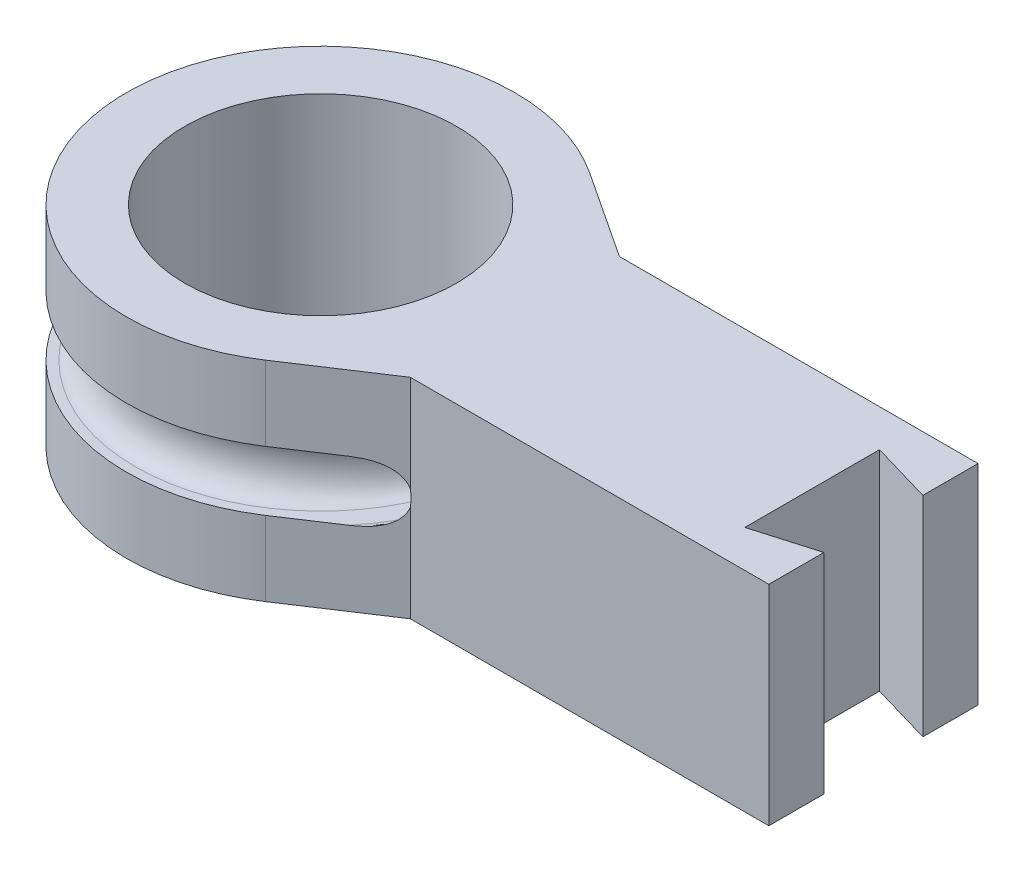
ISO-10303-21;
HEADER;
FILE_DESCRIPTION(('STEP AP214'),'2;1');
FILE_NAME('part.step','',(''),(''),'','','');
FILE_SCHEMA(('AUTOMOTIVE_DESIGN { 1 0 10303 214 1 1 1 1 }'));
ENDSEC;
DATA;
#1=APPLICATION_CONTEXT('core data for automotive mechanical design processes');
#2=APPLICATION_PROTOCOL_DEFINITION('international standard','automotive_design',2000,#1);
#3=PRODUCT_CONTEXT('',#1,'mechanical');
#4=PRODUCT('Part','Part','',(#3));
#5=PRODUCT_RELATED_PRODUCT_CATEGORY('part','',(#4));
#6=PRODUCT_DEFINITION_FORMATION('','',#4);
#7=PRODUCT_DEFINITION_CONTEXT('part definition',#1,'design');
#8=PRODUCT_DEFINITION('design','',#6,#7);
#9=PRODUCT_DEFINITION_SHAPE('','',#8);
#10=(LENGTH_UNIT() NAMED_UNIT(*) SI_UNIT(.MILLI.,.METRE.));
#11=(NAMED_UNIT(*) PLANE_ANGLE_UNIT() SI_UNIT($,.RADIAN.));
#12=(NAMED_UNIT(*) SI_UNIT($,.STERADIAN.) SOLID_ANGLE_UNIT());
#13=UNCERTAINTY_MEASURE_WITH_UNIT(LENGTH_MEASURE(1.E-05),#10,'distance_accuracy_value','');
#14=(GEOMETRIC_REPRESENTATION_CONTEXT(3) GLOBAL_UNCERTAINTY_ASSIGNED_CONTEXT((#13)) GLOBAL_UNIT_ASSIGNED_CONTEXT((#10,
#11,#12)) REPRESENTATION_CONTEXT('',''));
#15=CARTESIAN_POINT('',(0.,0.,0.));
#16=DIRECTION('',(0.,0.,1.));
#17=DIRECTION('',(1.,0.,0.));
#18=AXIS2_PLACEMENT_3D('',#15,#16,#17);
#19=CARTESIAN_POINT('',(6.5,7.,3.5));
#20=DIRECTION('',(0.55045871559633,0.,0.834862385321101));
#21=DIRECTION('',(0.834862385321101,0.,-0.550458715596331));
#22=AXIS2_PLACEMENT_3D('',#19,#20,#21);
#23=PLANE('',#22);
#24=DIRECTION('',(0.,-1.,0.));
#25=VECTOR('',#24,1.);
#26=CARTESIAN_POINT('',(6.5,7.,3.5));
#27=LINE('',#26,#25);
#28=CARTESIAN_POINT('',(6.5,3.22819521393696,3.5));
#29=VERTEX_POINT('',#28);
#30=CARTESIAN_POINT('',(6.5,0.,3.5));
#31=VERTEX_POINT('',#30);
#32=EDGE_CURVE('E136',#29,#31,#27,.T.);
#33=ORIENTED_EDGE('',*,*,#32,.F.);
#34=CARTESIAN_POINT('',(6.5,3.22819521393696,3.5));
#35=CARTESIAN_POINT('',(6.49298885962438,3.20469516467334,3.50462272991799));
#36=CARTESIAN_POINT('',(6.48509078213773,3.18159174419673,3.50983025353557));
#37=CARTESIAN_POINT('',(6.4676292095555,3.13632563999783,3.52134337831506));
#38=CARTESIAN_POINT('',(6.45806692554476,3.11416228665261,3.5276481809595));
#39=CARTESIAN_POINT('',(6.4271701424211,3.04954817687565,3.54801968631576));
#40=CARTESIAN_POINT('',(6.40352715088067,3.00864941863856,3.56360847194681));
#41=CARTESIAN_POINT('',(6.35122634688263,2.93199747904386,3.59809251853892));
#42=CARTESIAN_POINT('',(6.32258098093215,2.89623191890055,3.61697957301177));
#43=CARTESIAN_POINT('',(6.26130875530846,2.82999557694114,3.65737884265376));
#44=CARTESIAN_POINT('',(6.22867936221696,2.79952819436519,3.6788927282086));
#45=CARTESIAN_POINT('',(6.14261151228912,2.72931895435917,3.73564076112805));
#46=CARTESIAN_POINT('',(6.08720395804548,2.69304151305721,3.7721732144755));
#47=CARTESIAN_POINT('',(5.97202145654329,2.63130486525718,3.84811772096047));
#48=CARTESIAN_POINT('',(5.91221817444313,2.60592467527972,3.88754845641113));
#49=CARTESIAN_POINT('',(5.80290160328918,2.56869608794661,3.95962531651263));
#50=CARTESIAN_POINT('',(5.75377552755207,2.55514396868166,3.99201613567995));
#51=CARTESIAN_POINT('',(5.65469493921246,2.53298119535897,4.05734399612365));
#52=CARTESIAN_POINT('',(5.6047393361746,2.52437768043018,4.0902817563684));
#53=CARTESIAN_POINT('',(5.50558498743192,2.51141106624854,4.15565825004489));
#54=CARTESIAN_POINT('',(5.45639390173347,2.50695848848075,4.18809193292299));
#55=CARTESIAN_POINT('',(5.35804858954869,2.50126576603422,4.25293499590197));
#56=CARTESIAN_POINT('',(5.30889483077422,2.50001449332246,4.2853440676214));
#57=CARTESIAN_POINT('',(5.25977353990362,2.50000000000001,4.31773173193168));
#58=B_SPLINE_CURVE_WITH_KNOTS('',3,(#34,#35,#36,#37,#38,#39,#40,#41,#42,#43,#44,#45,#46,#47,#48,
#49,#50,#51,#52,#53,#54,#55,#56,#57),.UNSPECIFIED.,.F.,.F.,(4,2,2,2,2,2,2,2,2,2,2,4),(0.,
0.074812067165254,0.149569917637081,0.298065349054375,0.446196437635228,0.594422217290496,
0.820046961292381,1.04728117151874,1.22819830623822,1.40937579153491,1.58655078582427,
1.76310906141737),.UNSPECIFIED.);
#59=CARTESIAN_POINT('',(5.25977353990362,2.5,4.31773173193168));
#60=VERTEX_POINT('',#59);
#61=EDGE_CURVE('E301',#29,#60,#58,.T.);
#62=ORIENTED_EDGE('',*,*,#61,.T.);
#63=DIRECTION('',(-0.834862385321101,0.,0.550458715596331));
#64=VECTOR('',#63,1.);
#65=CARTESIAN_POINT('',(6.5,2.5,3.5));
#66=LINE('',#65,#64);
#67=CARTESIAN_POINT('',(3.57798165137617,2.5,5.42660550458714));
#68=VERTEX_POINT('',#67);
#69=EDGE_CURVE('E336',#60,#68,#66,.T.);
#70=ORIENTED_EDGE('',*,*,#69,.T.);
#71=DIRECTION('',(0.,-1.,0.));
#72=VECTOR('',#71,1.);
#73=CARTESIAN_POINT('',(3.57798165137617,7.,5.42660550458714));
#74=LINE('',#73,#72);
#75=CARTESIAN_POINT('',(3.57798165137617,0.,5.42660550458714));
#76=VERTEX_POINT('',#75);
#77=EDGE_CURVE('E199',#68,#76,#74,.T.);
#78=ORIENTED_EDGE('',*,*,#77,.T.);
#79=DIRECTION('',(-0.834862385321101,0.,0.550458715596331));
#80=VECTOR('',#79,1.);
#81=CARTESIAN_POINT('',(6.5,0.,3.5));
#82=LINE('',#81,#80);
#83=EDGE_CURVE('E200',#31,#76,#82,.T.);
#84=ORIENTED_EDGE('',*,*,#83,.F.);
#85=EDGE_LOOP('',(#33,#62,#70,#78,#84));
#86=FACE_BOUND('',#85,.T.);
#87=ADVANCED_FACE('F66',(#86),#23,.T.);
#88=DIRECTION('',(0.834862385321101,0.,-0.550458715596331));
#89=VECTOR('',#88,1.);
#90=CARTESIAN_POINT('',(6.5,4.5,3.5));
#91=LINE('',#90,#89);
#92=CARTESIAN_POINT('',(3.57798165137617,4.5,5.42660550458714));
#93=VERTEX_POINT('',#92);
#94=CARTESIAN_POINT('',(5.25977353990362,4.5,4.31773173193168));
#95=VERTEX_POINT('',#94);
#96=EDGE_CURVE('E87',#93,#95,#91,.T.);
#97=ORIENTED_EDGE('',*,*,#96,.T.);
#98=CARTESIAN_POINT('',(5.25977353990362,4.49999999999999,4.31773173193168));
#99=CARTESIAN_POINT('',(5.30980424482652,4.49998439536465,4.28474445396054));
#100=CARTESIAN_POINT('',(5.35987068639977,4.49868682887248,4.25173361336279));
#101=CARTESIAN_POINT('',(5.46005090812943,4.49276777287092,4.18568071991466));
#102=CARTESIAN_POINT('',(5.51016414799452,4.48813369889372,4.15263902330032));
#103=CARTESIAN_POINT('',(5.61094447698106,4.47464810066926,4.08619045473776));
#104=CARTESIAN_POINT('',(5.66160493164622,4.46572098860302,4.05278795715634));
#105=CARTESIAN_POINT('',(5.76204144244888,4.44271920763919,3.98656608190183));
#106=CARTESIAN_POINT('',(5.81181878729647,4.42865282179579,3.95374585452979));
#107=CARTESIAN_POINT('',(5.91591925169782,4.39229422808132,3.88510818569373));
#108=CARTESIAN_POINT('',(5.97005539985535,4.36920741181808,3.84941402207339));
#109=CARTESIAN_POINT('',(6.07484169827637,4.31405208518454,3.78032415498262));
#110=CARTESIAN_POINT('',(6.12550687984914,4.2820258141525,3.7469185407588));
#111=CARTESIAN_POINT('',(6.21346194251687,4.21418852231523,3.68892619174711));
#112=CARTESIAN_POINT('',(6.25156972941101,4.17991393322606,3.66380017841032));
#113=CARTESIAN_POINT('',(6.32255321365137,4.10433540844639,3.61699788110899));
#114=CARTESIAN_POINT('',(6.35543710357269,4.06304269401956,3.59531619544659));
#115=CARTESIAN_POINT('',(6.40934731927945,3.98149490764916,3.55977099827729));
#116=CARTESIAN_POINT('',(6.43143912221,3.9422574826338,3.54520497436703));
#117=CARTESIAN_POINT('',(6.46041108861024,3.88047320305739,3.5261025789383));
#118=CARTESIAN_POINT('',(6.46939610863209,3.85931801873014,3.52017838991291));
#119=CARTESIAN_POINT('',(6.4858560007254,3.8161630395596,3.50932571380743));
#120=CARTESIAN_POINT('',(6.49332976949673,3.79416264150562,3.50439795417798));
#121=CARTESIAN_POINT('',(6.5,3.77180478606305,3.5));
#122=B_SPLINE_CURVE_WITH_KNOTS('',3,(#98,#99,#100,#101,#102,#103,#104,#105,#106,#107,#108,#109,
#110,#111,#112,#113,#114,#115,#116,#117,#118,#119,#120,#121),.UNSPECIFIED.,.F.,.F.,(4,2,2,2,2,2,
2,2,2,2,2,4),(0.,0.179831729267228,0.360345315866386,0.544160534446972,0.727680792492196,
0.933606689487284,1.13857558490959,1.309156452813,1.47946710193905,1.62081594714583,
1.69194682388597,1.76312944423503),.UNSPECIFIED.);
#123=CARTESIAN_POINT('',(6.5,3.77180478606305,3.5));
#124=VERTEX_POINT('',#123);
#125=EDGE_CURVE('E327',#95,#124,#122,.T.);
#126=ORIENTED_EDGE('',*,*,#125,.T.);
#127=CARTESIAN_POINT('',(6.5,7.,3.5));
#128=VERTEX_POINT('',#127);
#129=EDGE_CURVE('E96',#128,#124,#27,.T.);
#130=ORIENTED_EDGE('',*,*,#129,.F.);
#131=DIRECTION('',(-0.834862385321101,0.,0.550458715596331));
#132=VECTOR('',#131,1.);
#133=CARTESIAN_POINT('',(6.5,7.,3.5));
#134=LINE('',#133,#132);
#135=CARTESIAN_POINT('',(3.57798165137617,7.,5.42660550458714));
#136=VERTEX_POINT('',#135);
#137=EDGE_CURVE('E227',#128,#136,#134,.T.);
#138=ORIENTED_EDGE('',*,*,#137,.T.);
#139=EDGE_CURVE('E246',#136,#93,#74,.T.);
#140=ORIENTED_EDGE('',*,*,#139,.T.);
#141=EDGE_LOOP('',(#97,#126,#130,#138,#140));
#142=FACE_BOUND('',#141,.T.);
#143=ADVANCED_FACE('F289',(#142),#23,.T.);
#144=CARTESIAN_POINT('',(6.5,7.,3.5));
#145=DIRECTION('',(0.,0.,-1.));
#146=DIRECTION('',(-1.,0.,0.));
#147=AXIS2_PLACEMENT_3D('',#144,#145,#146);
#148=PLANE('',#147);
#149=CARTESIAN_POINT('',(6.5,3.22819521393696,3.5));
#150=CARTESIAN_POINT('',(6.5304746179953,3.391795322888,3.50000000000001));
#151=CARTESIAN_POINT('',(6.53381508751579,3.55338363151334,3.50000000000001));
#152=CARTESIAN_POINT('',(6.50709218233565,3.73260551260419,3.5));
#153=CARTESIAN_POINT('',(6.50375171281517,3.75222039468755,3.5));
#154=CARTESIAN_POINT('',(6.5,3.77180478606305,3.5));
#155=B_SPLINE_CURVE_WITH_KNOTS('',3,(#149,#150,#151,#152,#153,#154),.UNSPECIFIED.,.F.,.F.,(4,2,
4),(0.,0.48486849968743,0.544560383740886),.UNSPECIFIED.);
#156=EDGE_CURVE('E329',#29,#124,#155,.T.);
#157=ORIENTED_EDGE('',*,*,#156,.F.);
#158=ORIENTED_EDGE('',*,*,#32,.T.);
#159=DIRECTION('',(1.,0.,0.));
#160=VECTOR('',#159,1.);
#161=CARTESIAN_POINT('',(6.5,0.,3.5));
#162=LINE('',#161,#160);
#163=CARTESIAN_POINT('',(18.5,0.,3.5));
#164=VERTEX_POINT('',#163);
#165=EDGE_CURVE('E225',#31,#164,#162,.T.);
#166=ORIENTED_EDGE('',*,*,#165,.T.);
#167=DIRECTION('',(0.,-1.,0.));
#168=VECTOR('',#167,1.);
#169=CARTESIAN_POINT('',(18.5,7.,3.5));
#170=LINE('',#169,#168);
#171=CARTESIAN_POINT('',(18.5,7.,3.5));
#172=VERTEX_POINT('',#171);
#173=EDGE_CURVE('E187',#172,#164,#170,.T.);
#174=ORIENTED_EDGE('',*,*,#173,.F.);
#175=DIRECTION('',(1.,0.,0.));
#176=VECTOR('',#175,1.);
#177=CARTESIAN_POINT('',(6.5,7.,3.5));
#178=LINE('',#177,#176);
#179=EDGE_CURVE('E174',#128,#172,#178,.T.);
#180=ORIENTED_EDGE('',*,*,#179,.F.);
#181=ORIENTED_EDGE('',*,*,#129,.T.);
#182=EDGE_LOOP('',(#157,#158,#166,#174,#180,#181));
#183=FACE_BOUND('',#182,.T.);
#184=ADVANCED_FACE('F294',(#183),#148,.F.);
#185=CARTESIAN_POINT('',(6.5,7.,-3.5));
#186=DIRECTION('',(0.,0.,-1.));
#187=DIRECTION('',(-1.,0.,0.));
#188=AXIS2_PLACEMENT_3D('',#185,#186,#187);
#189=PLANE('',#188);
#190=DIRECTION('',(0.,-1.,0.));
#191=VECTOR('',#190,1.);
#192=CARTESIAN_POINT('',(6.5,7.,-3.5));
#193=LINE('',#192,#191);
#194=CARTESIAN_POINT('',(6.5,3.22819521393695,-3.5));
#195=VERTEX_POINT('',#194);
#196=CARTESIAN_POINT('',(6.5,0.,-3.5));
#197=VERTEX_POINT('',#196);
#198=EDGE_CURVE('E241',#195,#197,#193,.T.);
#199=ORIENTED_EDGE('',*,*,#198,.F.);
#200=CARTESIAN_POINT('',(6.5,3.22819521393695,-3.5));
#201=CARTESIAN_POINT('',(6.53047461799531,3.39179532288799,-3.49999999999998));
#202=CARTESIAN_POINT('',(6.5338150875158,3.55338363151333,-3.49999999999998));
#203=CARTESIAN_POINT('',(6.50709218233565,3.73260551260419,-3.5));
#204=CARTESIAN_POINT('',(6.50375171281517,3.75222039468755,-3.5));
#205=CARTESIAN_POINT('',(6.5,3.77180478606305,-3.5));
#206=B_SPLINE_CURVE_WITH_KNOTS('',3,(#200,#201,#202,#203,#204,#205),.UNSPECIFIED.,.F.,.F.,(4,2,
4),(0.,0.48486849968743,0.544560383740898),.UNSPECIFIED.);
#207=CARTESIAN_POINT('',(6.5,3.77180478606305,-3.5));
#208=VERTEX_POINT('',#207);
#209=EDGE_CURVE('E343',#195,#208,#206,.T.);
#210=ORIENTED_EDGE('',*,*,#209,.T.);
#211=CARTESIAN_POINT('',(6.5,7.,-3.5));
#212=VERTEX_POINT('',#211);
#213=EDGE_CURVE('E238',#212,#208,#193,.T.);
#214=ORIENTED_EDGE('',*,*,#213,.F.);
#215=DIRECTION('',(1.,0.,0.));
#216=VECTOR('',#215,1.);
#217=CARTESIAN_POINT('',(6.5,7.,-3.5));
#218=LINE('',#217,#216);
#219=CARTESIAN_POINT('',(18.5,7.,-3.5));
#220=VERTEX_POINT('',#219);
#221=EDGE_CURVE('E544',#212,#220,#218,.T.);
#222=ORIENTED_EDGE('',*,*,#221,.T.);
#223=DIRECTION('',(0.,-1.,0.));
#224=VECTOR('',#223,1.);
#225=CARTESIAN_POINT('',(18.5,7.,-3.5));
#226=LINE('',#225,#224);
#227=CARTESIAN_POINT('',(18.5,0.,-3.5));
#228=VERTEX_POINT('',#227);
#229=EDGE_CURVE('E236',#220,#228,#226,.T.);
#230=ORIENTED_EDGE('',*,*,#229,.T.);
#231=DIRECTION('',(1.,0.,0.));
#232=VECTOR('',#231,1.);
#233=CARTESIAN_POINT('',(6.5,0.,-3.5));
#234=LINE('',#233,#232);
#235=EDGE_CURVE('E210',#197,#228,#234,.T.);
#236=ORIENTED_EDGE('',*,*,#235,.F.);
#237=EDGE_LOOP('',(#199,#210,#214,#222,#230,#236));
#238=FACE_BOUND('',#237,.T.);
#239=ADVANCED_FACE('F355',(#238),#189,.T.);
#240=CARTESIAN_POINT('',(6.5,7.,-3.5));
#241=DIRECTION('',(-0.550458715596331,0.,0.834862385321101));
#242=DIRECTION('',(0.834862385321101,0.,0.550458715596331));
#243=AXIS2_PLACEMENT_3D('',#240,#241,#242);
#244=PLANE('',#243);
#245=CARTESIAN_POINT('',(6.5,3.22819521393695,-3.5));
#246=CARTESIAN_POINT('',(6.49298885962437,3.20469516467334,-3.50462272991799));
#247=CARTESIAN_POINT('',(6.48509078213772,3.18159174419672,-3.50983025353557));
#248=CARTESIAN_POINT('',(6.4676292095555,3.13632563999783,-3.52134337831506));
#249=CARTESIAN_POINT('',(6.45806692554476,3.1141622866526,-3.5276481809595));
#250=CARTESIAN_POINT('',(6.4271701424211,3.04954817687564,-3.54801968631576));
#251=CARTESIAN_POINT('',(6.40352715088067,3.00864941863855,-3.56360847194681));
#252=CARTESIAN_POINT('',(6.35122634688263,2.93199747904385,-3.59809251853893));
#253=CARTESIAN_POINT('',(6.32258098093214,2.89623191890054,-3.61697957301177));
#254=CARTESIAN_POINT('',(6.26130875530845,2.82999557694114,-3.65737884265377));
#255=CARTESIAN_POINT('',(6.22867936221695,2.79952819436519,-3.6788927282086));
#256=CARTESIAN_POINT('',(6.14261151228911,2.72931895435917,-3.73564076112805));
#257=CARTESIAN_POINT('',(6.08720395804548,2.69304151305721,-3.77217321447551));
#258=CARTESIAN_POINT('',(5.97202145654328,2.63130486525718,-3.84811772096047));
#259=CARTESIAN_POINT('',(5.91221817444312,2.60592467527971,-3.88754845641113));
#260=CARTESIAN_POINT('',(5.80290160328917,2.5686960879466,-3.95962531651264));
#261=CARTESIAN_POINT('',(5.75377552755207,2.55514396868166,-3.99201613567995));
#262=CARTESIAN_POINT('',(5.65469493921245,2.53298119535897,-4.05734399612366));
#263=CARTESIAN_POINT('',(5.60473933617459,2.52437768043018,-4.0902817563684));
#264=CARTESIAN_POINT('',(5.50558498743192,2.51141106624854,-4.15565825004489));
#265=CARTESIAN_POINT('',(5.45639390173347,2.50695848848075,-4.18809193292299));
#266=CARTESIAN_POINT('',(5.35804858954869,2.50126576603422,-4.25293499590196));
#267=CARTESIAN_POINT('',(5.30889483077422,2.50001449332246,-4.28534406762139));
#268=CARTESIAN_POINT('',(5.25977353990362,2.50000000000001,-4.31773173193167));
#269=B_SPLINE_CURVE_WITH_KNOTS('',3,(#245,#246,#247,#248,#249,#250,#251,#252,#253,#254,#255,
#256,#257,#258,#259,#260,#261,#262,#263,#264,#265,#266,#267,#268),.UNSPECIFIED.,.F.,.F.,(4,2,2,
2,2,2,2,2,2,2,2,4),(0.,0.0748120671652539,0.149569917637081,0.298065349054377,0.446196437635229,
0.594422217290497,0.820046961292383,1.04728117151874,1.22819830623822,1.40937579153491,
1.58655078582426,1.76310906141736),.UNSPECIFIED.);
#270=CARTESIAN_POINT('',(5.25977353990362,2.5,-4.31773173193168));
#271=VERTEX_POINT('',#270);
#272=EDGE_CURVE('E12',#195,#271,#269,.T.);
#273=ORIENTED_EDGE('',*,*,#272,.F.);
#274=ORIENTED_EDGE('',*,*,#198,.T.);
#275=DIRECTION('',(-0.834862385321101,0.,-0.550458715596331));
#276=VECTOR('',#275,1.);
#277=CARTESIAN_POINT('',(6.5,0.,-3.5));
#278=LINE('',#277,#276);
#279=CARTESIAN_POINT('',(3.57798165137615,0.,-5.42660550458716));
#280=VERTEX_POINT('',#279);
#281=EDGE_CURVE('E207',#197,#280,#278,.T.);
#282=ORIENTED_EDGE('',*,*,#281,.T.);
#283=DIRECTION('',(0.,-1.,0.));
#284=VECTOR('',#283,1.);
#285=CARTESIAN_POINT('',(3.57798165137615,7.,-5.42660550458716));
#286=LINE('',#285,#284);
#287=CARTESIAN_POINT('',(3.57798165137615,2.5,-5.42660550458716));
#288=VERTEX_POINT('',#287);
#289=EDGE_CURVE('E245',#288,#280,#286,.T.);
#290=ORIENTED_EDGE('',*,*,#289,.F.);
#291=DIRECTION('',(-0.834862385321101,0.,-0.550458715596331));
#292=VECTOR('',#291,1.);
#293=CARTESIAN_POINT('',(6.5,2.5,-3.5));
#294=LINE('',#293,#292);
#295=EDGE_CURVE('E334',#271,#288,#294,.T.);
#296=ORIENTED_EDGE('',*,*,#295,.F.);
#297=EDGE_LOOP('',(#273,#274,#282,#290,#296));
#298=FACE_BOUND('',#297,.T.);
#299=ADVANCED_FACE('F257',(#298),#244,.F.);
#300=CARTESIAN_POINT('',(5.25977353990362,4.49999999999999,-4.31773173193168));
#301=CARTESIAN_POINT('',(5.30980424482652,4.49998439536465,-4.28474445396054));
#302=CARTESIAN_POINT('',(5.35987068639978,4.49868682887249,-4.25173361336279));
#303=CARTESIAN_POINT('',(5.46005090812944,4.49276777287092,-4.18568071991466));
#304=CARTESIAN_POINT('',(5.51016414799452,4.48813369889372,-4.15263902330031));
#305=CARTESIAN_POINT('',(5.61094447698106,4.47464810066926,-4.08619045473776));
#306=CARTESIAN_POINT('',(5.66160493164622,4.46572098860302,-4.05278795715634));
#307=CARTESIAN_POINT('',(5.76204144244888,4.44271920763919,-3.98656608190183));
#308=CARTESIAN_POINT('',(5.81181878729647,4.42865282179579,-3.95374585452979));
#309=CARTESIAN_POINT('',(5.91591925169783,4.39229422808132,-3.88510818569373));
#310=CARTESIAN_POINT('',(5.97005539985535,4.36920741181808,-3.84941402207339));
#311=CARTESIAN_POINT('',(6.07484169827637,4.31405208518454,-3.78032415498262));
#312=CARTESIAN_POINT('',(6.12550687984914,4.2820258141525,-3.7469185407588));
#313=CARTESIAN_POINT('',(6.21346194251688,4.21418852231523,-3.68892619174711));
#314=CARTESIAN_POINT('',(6.25156972941101,4.17991393322605,-3.66380017841032));
#315=CARTESIAN_POINT('',(6.32255321365138,4.10433540844639,-3.61699788110898));
#316=CARTESIAN_POINT('',(6.35543710357269,4.06304269401956,-3.59531619544657));
#317=CARTESIAN_POINT('',(6.40934731927945,3.98149490764916,-3.55977099827728));
#318=CARTESIAN_POINT('',(6.43143912221,3.9422574826338,-3.54520497436703));
#319=CARTESIAN_POINT('',(6.46041108861024,3.88047320305738,-3.5261025789383));
#320=CARTESIAN_POINT('',(6.46939610863209,3.85931801873014,-3.52017838991291));
#321=CARTESIAN_POINT('',(6.4858560007254,3.81616303955961,-3.50932571380743));
#322=CARTESIAN_POINT('',(6.49332976949673,3.79416264150563,-3.50439795417798));
#323=CARTESIAN_POINT('',(6.5,3.77180478606305,-3.5));
#324=B_SPLINE_CURVE_WITH_KNOTS('',3,(#300,#301,#302,#303,#304,#305,#306,#307,#308,#309,#310,
#311,#312,#313,#314,#315,#316,#317,#318,#319,#320,#321,#322,#323),.UNSPECIFIED.,.F.,.F.,(4,2,2,
2,2,2,2,2,2,2,2,4),(0.,0.179831729267229,0.360345315866388,0.544160534446972,0.727680792492197,
0.933606689487283,1.13857558490959,1.309156452813,1.47946710193905,1.62081594714583,
1.69194682388597,1.76312944423502),.UNSPECIFIED.);
#325=CARTESIAN_POINT('',(5.25977353990362,4.5,-4.31773173193168));
#326=VERTEX_POINT('',#325);
#327=EDGE_CURVE('E80',#326,#208,#324,.T.);
#328=ORIENTED_EDGE('',*,*,#327,.F.);
#329=DIRECTION('',(0.834862385321101,0.,0.550458715596331));
#330=VECTOR('',#329,1.);
#331=CARTESIAN_POINT('',(6.5,4.5,-3.5));
#332=LINE('',#331,#330);
#333=CARTESIAN_POINT('',(3.57798165137615,4.5,-5.42660550458716));
#334=VERTEX_POINT('',#333);
#335=EDGE_CURVE('E332',#334,#326,#332,.T.);
#336=ORIENTED_EDGE('',*,*,#335,.F.);
#337=CARTESIAN_POINT('',(3.57798165137615,7.,-5.42660550458716));
#338=VERTEX_POINT('',#337);
#339=EDGE_CURVE('E242',#338,#334,#286,.T.);
#340=ORIENTED_EDGE('',*,*,#339,.F.);
#341=DIRECTION('',(-0.834862385321101,0.,-0.550458715596331));
#342=VECTOR('',#341,1.);
#343=CARTESIAN_POINT('',(6.5,7.,-3.5));
#344=LINE('',#343,#342);
#345=EDGE_CURVE('E542',#212,#338,#344,.T.);
#346=ORIENTED_EDGE('',*,*,#345,.F.);
#347=ORIENTED_EDGE('',*,*,#213,.T.);
#348=EDGE_LOOP('',(#328,#336,#340,#346,#347));
#349=FACE_BOUND('',#348,.T.);
#350=ADVANCED_FACE('F391',(#349),#244,.F.);
#351=CARTESIAN_POINT('',(0.,7.,0.));
#352=DIRECTION('',(0.,-1.,0.));
#353=DIRECTION('',(0.,0.,-1.));
#354=AXIS2_PLACEMENT_3D('',#351,#352,#353);
#355=CYLINDRICAL_SURFACE('',#354,6.5);
#356=CARTESIAN_POINT('',(0.,2.5,0.));
#357=DIRECTION('',(0.,1.,0.));
#358=DIRECTION('',(0.,0.,1.));
#359=AXIS2_PLACEMENT_3D('',#356,#357,#358);
#360=CIRCLE('',#359,6.5);
#361=EDGE_CURVE('E250',#288,#68,#360,.T.);
#362=ORIENTED_EDGE('',*,*,#361,.F.);
#363=ORIENTED_EDGE('',*,*,#289,.T.);
#364=CARTESIAN_POINT('',(0.,0.,0.));
#365=DIRECTION('',(0.,1.,0.));
#366=DIRECTION('',(0.,0.,1.));
#367=AXIS2_PLACEMENT_3D('',#364,#365,#366);
#368=CIRCLE('',#367,6.5);
#369=EDGE_CURVE('E203',#280,#76,#368,.T.);
#370=ORIENTED_EDGE('',*,*,#369,.T.);
#371=ORIENTED_EDGE('',*,*,#77,.F.);
#372=EDGE_LOOP('',(#362,#363,#370,#371));
#373=FACE_BOUND('',#372,.T.);
#374=ADVANCED_FACE('F386',(#373),#355,.T.);
#375=CARTESIAN_POINT('',(0.,4.5,0.));
#376=DIRECTION('',(0.,-1.,0.));
#377=DIRECTION('',(0.,0.,-1.));
#378=AXIS2_PLACEMENT_3D('',#375,#376,#377);
#379=CIRCLE('',#378,6.5);
#380=EDGE_CURVE('E229',#93,#334,#379,.T.);
#381=ORIENTED_EDGE('',*,*,#380,.F.);
#382=ORIENTED_EDGE('',*,*,#139,.F.);
#383=CARTESIAN_POINT('',(0.,7.,0.));
#384=DIRECTION('',(0.,1.,0.));
#385=DIRECTION('',(0.,0.,1.));
#386=AXIS2_PLACEMENT_3D('',#383,#384,#385);
#387=CIRCLE('',#386,6.5);
#388=EDGE_CURVE('E145',#338,#136,#387,.T.);
#389=ORIENTED_EDGE('',*,*,#388,.F.);
#390=ORIENTED_EDGE('',*,*,#339,.T.);
#391=EDGE_LOOP('',(#381,#382,#389,#390));
#392=FACE_BOUND('',#391,.T.);
#393=ADVANCED_FACE('F382',(#392),#355,.T.);
#394=CARTESIAN_POINT('',(0.,7.,0.));
#395=DIRECTION('',(0.,1.,0.));
#396=DIRECTION('',(0.,0.,1.));
#397=AXIS2_PLACEMENT_3D('',#394,#395,#396);
#398=PLANE('',#397);
#399=ORIENTED_EDGE('',*,*,#137,.F.);
#400=ORIENTED_EDGE('',*,*,#179,.T.);
#401=DIRECTION('',(0.,0.,-1.));
#402=VECTOR('',#401,1.);
#403=CARTESIAN_POINT('',(18.5,7.,3.5));
#404=LINE('',#403,#402);
#405=CARTESIAN_POINT('',(18.5,7.,1.655));
#406=VERTEX_POINT('',#405);
#407=EDGE_CURVE('E168',#172,#406,#404,.T.);
#408=ORIENTED_EDGE('',*,*,#407,.T.);
#409=DIRECTION('',(0.95973740700827,0.,-0.280898753270716));
#410=VECTOR('',#409,1.);
#411=CARTESIAN_POINT('',(16.45,7.,2.255));
#412=LINE('',#411,#410);
#413=CARTESIAN_POINT('',(16.45,7.,2.255));
#414=VERTEX_POINT('',#413);
#415=EDGE_CURVE('E173',#414,#406,#412,.T.);
#416=ORIENTED_EDGE('',*,*,#415,.F.);
#417=DIRECTION('',(0.,0.,-1.));
#418=VECTOR('',#417,1.);
#419=CARTESIAN_POINT('',(16.45,7.,2.255));
#420=LINE('',#419,#418);
#421=CARTESIAN_POINT('',(16.45,7.,-2.255));
#422=VERTEX_POINT('',#421);
#423=EDGE_CURVE('E192',#414,#422,#420,.T.);
#424=ORIENTED_EDGE('',*,*,#423,.T.);
#425=DIRECTION('',(-0.959737407008271,0.,-0.280898753270713));
#426=VECTOR('',#425,1.);
#427=CARTESIAN_POINT('',(18.5,7.,-1.655));
#428=LINE('',#427,#426);
#429=CARTESIAN_POINT('',(18.5,7.,-1.655));
#430=VERTEX_POINT('',#429);
#431=EDGE_CURVE('E194',#430,#422,#428,.T.);
#432=ORIENTED_EDGE('',*,*,#431,.F.);
#433=DIRECTION('',(0.,0.,-1.));
#434=VECTOR('',#433,1.);
#435=CARTESIAN_POINT('',(18.5,7.,-1.655));
#436=LINE('',#435,#434);
#437=EDGE_CURVE('E546',#430,#220,#436,.T.);
#438=ORIENTED_EDGE('',*,*,#437,.T.);
#439=ORIENTED_EDGE('',*,*,#221,.F.);
#440=ORIENTED_EDGE('',*,*,#345,.T.);
#441=ORIENTED_EDGE('',*,*,#388,.T.);
#442=EDGE_LOOP('',(#399,#400,#408,#416,#424,#432,#438,#439,#440,#441));
#443=FACE_BOUND('',#442,.T.);
#444=CARTESIAN_POINT('',(0.,7.,0.));
#445=DIRECTION('',(0.,1.,0.));
#446=DIRECTION('',(0.,0.,1.));
#447=AXIS2_PLACEMENT_3D('',#444,#445,#446);
#448=CIRCLE('',#447,4.55);
#449=CARTESIAN_POINT('',(0.,7.,4.55));
#450=VERTEX_POINT('',#449);
#451=EDGE_CURVE('E204',#450,#450,#448,.T.);
#452=ORIENTED_EDGE('',*,*,#451,.F.);
#453=EDGE_LOOP('',(#452));
#454=FACE_BOUND('',#453,.T.);
#455=ADVANCED_FACE('F170',(#443,#454),#398,.T.);
#456=CARTESIAN_POINT('',(0.,0.,0.));
#457=DIRECTION('',(0.,1.,0.));
#458=DIRECTION('',(0.,0.,1.));
#459=AXIS2_PLACEMENT_3D('',#456,#457,#458);
#460=PLANE('',#459);
#461=ORIENTED_EDGE('',*,*,#83,.T.);
#462=ORIENTED_EDGE('',*,*,#369,.F.);
#463=ORIENTED_EDGE('',*,*,#281,.F.);
#464=ORIENTED_EDGE('',*,*,#235,.T.);
#465=DIRECTION('',(0.,0.,-1.));
#466=VECTOR('',#465,1.);
#467=CARTESIAN_POINT('',(18.5,0.,-1.655));
#468=LINE('',#467,#466);
#469=CARTESIAN_POINT('',(18.5,0.,-1.655));
#470=VERTEX_POINT('',#469);
#471=EDGE_CURVE('E213',#470,#228,#468,.T.);
#472=ORIENTED_EDGE('',*,*,#471,.F.);
#473=DIRECTION('',(-0.959737407008271,0.,-0.280898753270713));
#474=VECTOR('',#473,1.);
#475=CARTESIAN_POINT('',(18.5,0.,-1.655));
#476=LINE('',#475,#474);
#477=CARTESIAN_POINT('',(16.45,0.,-2.255));
#478=VERTEX_POINT('',#477);
#479=EDGE_CURVE('E216',#470,#478,#476,.T.);
#480=ORIENTED_EDGE('',*,*,#479,.T.);
#481=DIRECTION('',(0.,0.,-1.));
#482=VECTOR('',#481,1.);
#483=CARTESIAN_POINT('',(16.45,0.,2.255));
#484=LINE('',#483,#482);
#485=CARTESIAN_POINT('',(16.45,0.,2.255));
#486=VERTEX_POINT('',#485);
#487=EDGE_CURVE('E219',#486,#478,#484,.T.);
#488=ORIENTED_EDGE('',*,*,#487,.F.);
#489=DIRECTION('',(0.95973740700827,0.,-0.280898753270716));
#490=VECTOR('',#489,1.);
#491=CARTESIAN_POINT('',(16.45,0.,2.255));
#492=LINE('',#491,#490);
#493=CARTESIAN_POINT('',(18.5,0.,1.655));
#494=VERTEX_POINT('',#493);
#495=EDGE_CURVE('E222',#486,#494,#492,.T.);
#496=ORIENTED_EDGE('',*,*,#495,.T.);
#497=DIRECTION('',(0.,0.,-1.));
#498=VECTOR('',#497,1.);
#499=CARTESIAN_POINT('',(18.5,0.,3.5));
#500=LINE('',#499,#498);
#501=EDGE_CURVE('E183',#164,#494,#500,.T.);
#502=ORIENTED_EDGE('',*,*,#501,.F.);
#503=ORIENTED_EDGE('',*,*,#165,.F.);
#504=EDGE_LOOP('',(#461,#462,#463,#464,#472,#480,#488,#496,#502,#503));
#505=FACE_BOUND('',#504,.T.);
#506=CARTESIAN_POINT('',(0.,0.,0.));
#507=DIRECTION('',(0.,1.,0.));
#508=DIRECTION('',(0.,0.,1.));
#509=AXIS2_PLACEMENT_3D('',#506,#507,#508);
#510=CIRCLE('',#509,4.55);
#511=CARTESIAN_POINT('',(0.,0.,4.55));
#512=VERTEX_POINT('',#511);
#513=EDGE_CURVE('E535',#512,#512,#510,.T.);
#514=ORIENTED_EDGE('',*,*,#513,.T.);
#515=EDGE_LOOP('',(#514));
#516=FACE_BOUND('',#515,.T.);
#517=ADVANCED_FACE('F375',(#505,#516),#460,.F.);
#518=CARTESIAN_POINT('',(18.5,7.,3.5));
#519=DIRECTION('',(-1.,0.,0.));
#520=DIRECTION('',(0.,0.,1.));
#521=AXIS2_PLACEMENT_3D('',#518,#519,#520);
#522=PLANE('',#521);
#523=ORIENTED_EDGE('',*,*,#501,.T.);
#524=DIRECTION('',(0.,-1.,0.));
#525=VECTOR('',#524,1.);
#526=CARTESIAN_POINT('',(18.5,7.,1.655));
#527=LINE('',#526,#525);
#528=EDGE_CURVE('E180',#406,#494,#527,.T.);
#529=ORIENTED_EDGE('',*,*,#528,.F.);
#530=ORIENTED_EDGE('',*,*,#407,.F.);
#531=ORIENTED_EDGE('',*,*,#173,.T.);
#532=EDGE_LOOP('',(#523,#529,#530,#531));
#533=FACE_BOUND('',#532,.T.);
#534=ADVANCED_FACE('F181',(#533),#522,.F.);
#535=CARTESIAN_POINT('',(16.45,7.,2.255));
#536=DIRECTION('',(-0.280898753270716,0.,-0.95973740700827));
#537=DIRECTION('',(-0.95973740700827,0.,0.280898753270716));
#538=AXIS2_PLACEMENT_3D('',#535,#536,#537);
#539=PLANE('',#538);
#540=ORIENTED_EDGE('',*,*,#495,.F.);
#541=DIRECTION('',(0.,-1.,0.));
#542=VECTOR('',#541,1.);
#543=CARTESIAN_POINT('',(16.45,7.,2.255));
#544=LINE('',#543,#542);
#545=EDGE_CURVE('E188',#414,#486,#544,.T.);
#546=ORIENTED_EDGE('',*,*,#545,.F.);
#547=ORIENTED_EDGE('',*,*,#415,.T.);
#548=ORIENTED_EDGE('',*,*,#528,.T.);
#549=EDGE_LOOP('',(#540,#546,#547,#548));
#550=FACE_BOUND('',#549,.T.);
#551=ADVANCED_FACE('F190',(#550),#539,.T.);
#552=CARTESIAN_POINT('',(16.45,7.,2.255));
#553=DIRECTION('',(-1.,0.,0.));
#554=DIRECTION('',(0.,0.,1.));
#555=AXIS2_PLACEMENT_3D('',#552,#553,#554);
#556=PLANE('',#555);
#557=ORIENTED_EDGE('',*,*,#487,.T.);
#558=DIRECTION('',(0.,-1.,0.));
#559=VECTOR('',#558,1.);
#560=CARTESIAN_POINT('',(16.45,7.,-2.255));
#561=LINE('',#560,#559);
#562=EDGE_CURVE('E232',#422,#478,#561,.T.);
#563=ORIENTED_EDGE('',*,*,#562,.F.);
#564=ORIENTED_EDGE('',*,*,#423,.F.);
#565=ORIENTED_EDGE('',*,*,#545,.T.);
#566=EDGE_LOOP('',(#557,#563,#564,#565));
#567=FACE_BOUND('',#566,.T.);
#568=ADVANCED_FACE('F367',(#567),#556,.F.);
#569=CARTESIAN_POINT('',(18.5,7.,-1.655));
#570=DIRECTION('',(-0.280898753270713,0.,0.959737407008271));
#571=DIRECTION('',(0.959737407008271,0.,0.280898753270713));
#572=AXIS2_PLACEMENT_3D('',#569,#570,#571);
#573=PLANE('',#572);
#574=ORIENTED_EDGE('',*,*,#479,.F.);
#575=DIRECTION('',(0.,-1.,0.));
#576=VECTOR('',#575,1.);
#577=CARTESIAN_POINT('',(18.5,7.,-1.655));
#578=LINE('',#577,#576);
#579=EDGE_CURVE('E234',#430,#470,#578,.T.);
#580=ORIENTED_EDGE('',*,*,#579,.F.);
#581=ORIENTED_EDGE('',*,*,#431,.T.);
#582=ORIENTED_EDGE('',*,*,#562,.T.);
#583=EDGE_LOOP('',(#574,#580,#581,#582));
#584=FACE_BOUND('',#583,.T.);
#585=ADVANCED_FACE('F363',(#584),#573,.T.);
#586=CARTESIAN_POINT('',(18.5,7.,-1.655));
#587=DIRECTION('',(-1.,0.,0.));
#588=DIRECTION('',(0.,0.,1.));
#589=AXIS2_PLACEMENT_3D('',#586,#587,#588);
#590=PLANE('',#589);
#591=ORIENTED_EDGE('',*,*,#471,.T.);
#592=ORIENTED_EDGE('',*,*,#229,.F.);
#593=ORIENTED_EDGE('',*,*,#437,.F.);
#594=ORIENTED_EDGE('',*,*,#579,.T.);
#595=EDGE_LOOP('',(#591,#592,#593,#594));
#596=FACE_BOUND('',#595,.T.);
#597=ADVANCED_FACE('F360',(#596),#590,.F.);
#598=CARTESIAN_POINT('',(0.,7.,0.));
#599=DIRECTION('',(0.,-1.,0.));
#600=DIRECTION('',(0.,0.,-1.));
#601=AXIS2_PLACEMENT_3D('',#598,#599,#600);
#602=CYLINDRICAL_SURFACE('',#601,4.55);
#603=ORIENTED_EDGE('',*,*,#451,.T.);
#604=EDGE_LOOP('',(#603));
#605=FACE_BOUND('',#604,.T.);
#606=ORIENTED_EDGE('',*,*,#513,.F.);
#607=EDGE_LOOP('',(#606));
#608=FACE_BOUND('',#607,.T.);
#609=ADVANCED_FACE('F267',(#605,#608),#602,.F.);
#610=CARTESIAN_POINT('',(0.,3.5,-6.80500008497696));
#611=DIRECTION('',(1.,0.,0.));
#612=DIRECTION('',(0.,1.,0.));
#613=AXIS2_PLACEMENT_3D('',#610,#611,#612);
#614=ELLIPSE('',#613,1.,0.6);
#615=CARTESIAN_POINT('',(0.,7.3353184568774,0.));
#616=DIRECTION('',(0.,1.,0.));
#617=AXIS1_PLACEMENT('',#615,#616);
#618=SURFACE_OF_REVOLUTION('',#614,#617);
#619=ORIENTED_EDGE('',*,*,#156,.T.);
#620=ORIENTED_EDGE('',*,*,#125,.F.);
#621=CARTESIAN_POINT('',(0.,4.5,0.));
#622=DIRECTION('',(0.,1.,0.));
#623=DIRECTION('',(0.,0.,1.));
#624=AXIS2_PLACEMENT_3D('',#621,#622,#623);
#625=CIRCLE('',#624,6.805);
#626=EDGE_CURVE('E277',#95,#326,#625,.T.);
#627=ORIENTED_EDGE('',*,*,#626,.T.);
#628=ORIENTED_EDGE('',*,*,#327,.T.);
#629=ORIENTED_EDGE('',*,*,#209,.F.);
#630=ORIENTED_EDGE('',*,*,#272,.T.);
#631=CARTESIAN_POINT('',(0.,2.5,0.));
#632=DIRECTION('',(0.,1.,0.));
#633=DIRECTION('',(0.,0.,1.));
#634=AXIS2_PLACEMENT_3D('',#631,#632,#633);
#635=CIRCLE('',#634,6.805);
#636=EDGE_CURVE('E338',#60,#271,#635,.T.);
#637=ORIENTED_EDGE('',*,*,#636,.F.);
#638=ORIENTED_EDGE('',*,*,#61,.F.);
#639=EDGE_LOOP('',(#619,#620,#627,#628,#629,#630,#637,#638));
#640=FACE_BOUND('',#639,.T.);
#641=ADVANCED_FACE('F260',(#640),#618,.F.);
#642=CARTESIAN_POINT('',(0.,2.5,-6.195));
#643=DIRECTION('',(0.,1.,0.));
#644=DIRECTION('',(0.,0.,1.));
#645=AXIS2_PLACEMENT_3D('',#642,#643,#644);
#646=PLANE('',#645);
#647=ORIENTED_EDGE('',*,*,#636,.T.);
#648=ORIENTED_EDGE('',*,*,#295,.T.);
#649=ORIENTED_EDGE('',*,*,#361,.T.);
#650=ORIENTED_EDGE('',*,*,#69,.F.);
#651=EDGE_LOOP('',(#647,#648,#649,#650));
#652=FACE_BOUND('',#651,.T.);
#653=CARTESIAN_POINT('',(0.,2.5,0.));
#654=DIRECTION('',(0.,1.,0.));
#655=DIRECTION('',(0.,0.,1.));
#656=AXIS2_PLACEMENT_3D('',#653,#654,#655);
#657=CIRCLE('',#656,6.195);
#658=CARTESIAN_POINT('',(0.,2.5,6.195));
#659=VERTEX_POINT('',#658);
#660=EDGE_CURVE('E412',#659,#659,#657,.T.);
#661=ORIENTED_EDGE('',*,*,#660,.F.);
#662=EDGE_LOOP('',(#661));
#663=FACE_BOUND('',#662,.T.);
#664=ADVANCED_FACE('F266',(#652,#663),#646,.T.);
#665=CARTESIAN_POINT('',(0.,3.5,-6.195));
#666=DIRECTION('',(1.,0.,0.));
#667=DIRECTION('',(0.,1.,0.));
#668=AXIS2_PLACEMENT_3D('',#665,#666,#667);
#669=ELLIPSE('',#668,1.,0.6);
#670=CARTESIAN_POINT('',(0.,7.3353184568774,0.));
#671=DIRECTION('',(0.,1.,0.));
#672=AXIS1_PLACEMENT('',#670,#671);
#673=SURFACE_OF_REVOLUTION('',#669,#672);
#674=ORIENTED_EDGE('',*,*,#660,.T.);
#675=EDGE_LOOP('',(#674));
#676=FACE_BOUND('',#675,.T.);
#677=CARTESIAN_POINT('',(0.,4.5,0.));
#678=DIRECTION('',(0.,1.,0.));
#679=DIRECTION('',(0.,0.,1.));
#680=AXIS2_PLACEMENT_3D('',#677,#678,#679);
#681=CIRCLE('',#680,6.195);
#682=CARTESIAN_POINT('',(0.,4.5,6.195));
#683=VERTEX_POINT('',#682);
#684=EDGE_CURVE('E333',#683,#683,#681,.T.);
#685=ORIENTED_EDGE('',*,*,#684,.F.);
#686=EDGE_LOOP('',(#685));
#687=FACE_BOUND('',#686,.T.);
#688=ADVANCED_FACE('F279',(#676,#687),#673,.F.);
#689=CARTESIAN_POINT('',(0.,4.5,-6.805));
#690=DIRECTION('',(0.,-1.,0.));
#691=DIRECTION('',(0.,0.,-1.));
#692=AXIS2_PLACEMENT_3D('',#689,#690,#691);
#693=PLANE('',#692);
#694=ORIENTED_EDGE('',*,*,#380,.T.);
#695=ORIENTED_EDGE('',*,*,#335,.T.);
#696=ORIENTED_EDGE('',*,*,#626,.F.);
#697=ORIENTED_EDGE('',*,*,#96,.F.);
#698=EDGE_LOOP('',(#694,#695,#696,#697));
#699=FACE_BOUND('',#698,.T.);
#700=ORIENTED_EDGE('',*,*,#684,.T.);
#701=EDGE_LOOP('',(#700));
#702=FACE_BOUND('',#701,.T.);
#703=ADVANCED_FACE('F282',(#699,#702),#693,.T.);
#704=CLOSED_SHELL('',(#87,#143,#184,#239,#299,#350,#374,#393,#455,#517,#534,#551,#568,#585,#597,
#609,#641,#664,#688,#703));
#705=MANIFOLD_SOLID_BREP('B2',#704);
#706=ADVANCED_BREP_SHAPE_REPRESENTATION('',(#18,#705),#14);
#707=SHAPE_DEFINITION_REPRESENTATION(#9,#706);
ENDSEC;
END-ISO-10303-21;
